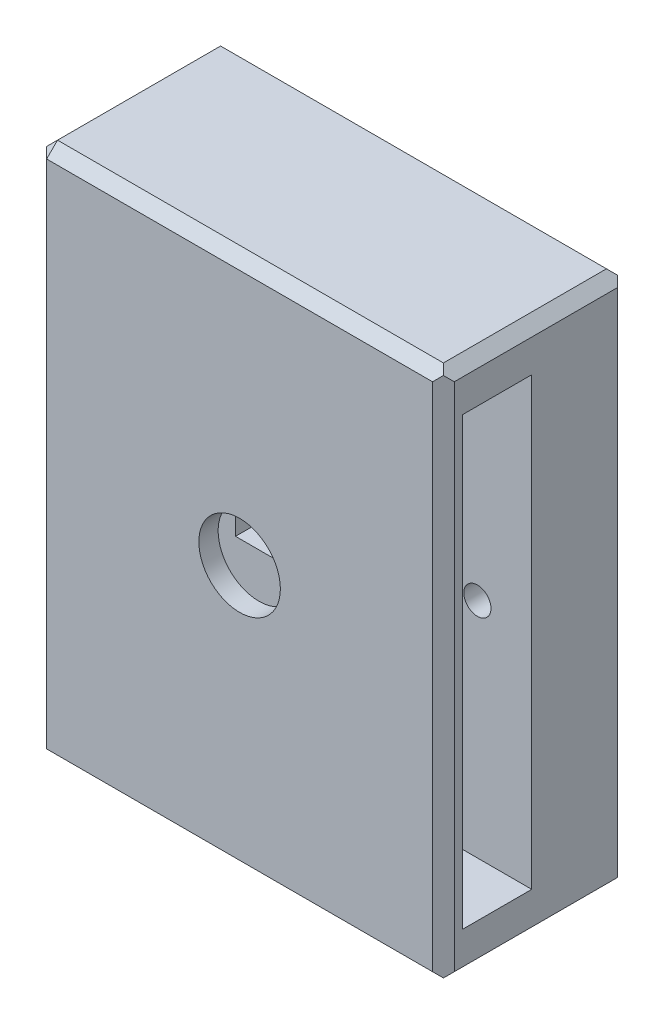
ISO-10303-21;
HEADER;
FILE_DESCRIPTION(('STEP AP214'),'2;1');
FILE_NAME('part.step','',(''),(''),'','','');
FILE_SCHEMA(('AUTOMOTIVE_DESIGN { 1 0 10303 214 1 1 1 1 }'));
ENDSEC;
DATA;
#1=APPLICATION_CONTEXT('core data for automotive mechanical design processes');
#2=APPLICATION_PROTOCOL_DEFINITION('international standard','automotive_design',2000,#1);
#3=PRODUCT_CONTEXT('',#1,'mechanical');
#4=PRODUCT('Part','Part','',(#3));
#5=PRODUCT_RELATED_PRODUCT_CATEGORY('part','',(#4));
#6=PRODUCT_DEFINITION_FORMATION('','',#4);
#7=PRODUCT_DEFINITION_CONTEXT('part definition',#1,'design');
#8=PRODUCT_DEFINITION('design','',#6,#7);
#9=PRODUCT_DEFINITION_SHAPE('','',#8);
#10=(LENGTH_UNIT() NAMED_UNIT(*) SI_UNIT(.MILLI.,.METRE.));
#11=(NAMED_UNIT(*) PLANE_ANGLE_UNIT() SI_UNIT($,.RADIAN.));
#12=(NAMED_UNIT(*) SI_UNIT($,.STERADIAN.) SOLID_ANGLE_UNIT());
#13=UNCERTAINTY_MEASURE_WITH_UNIT(LENGTH_MEASURE(1.E-05),#10,'distance_accuracy_value','');
#14=(GEOMETRIC_REPRESENTATION_CONTEXT(3) GLOBAL_UNCERTAINTY_ASSIGNED_CONTEXT((#13)) GLOBAL_UNIT_ASSIGNED_CONTEXT((#10,
#11,#12)) REPRESENTATION_CONTEXT('',''));
#15=CARTESIAN_POINT('',(0.,0.,0.));
#16=DIRECTION('',(0.,0.,1.));
#17=DIRECTION('',(1.,0.,0.));
#18=AXIS2_PLACEMENT_3D('',#15,#16,#17);
#19=CARTESIAN_POINT('',(0.,49.,0.));
#20=DIRECTION('',(1.,0.,0.));
#21=DIRECTION('',(0.,0.,-1.));
#22=AXIS2_PLACEMENT_3D('',#19,#20,#21);
#23=PLANE('',#22);
#24=DIRECTION('',(0.,-1.,0.));
#25=VECTOR('',#24,1.);
#26=CARTESIAN_POINT('',(0.,49.,-24.));
#27=LINE('',#26,#25);
#28=CARTESIAN_POINT('',(0.,48.,-24.));
#29=VERTEX_POINT('',#28);
#30=CARTESIAN_POINT('',(0.,0.999999999999994,-24.));
#31=VERTEX_POINT('',#30);
#32=EDGE_CURVE('E297',#29,#31,#27,.T.);
#33=ORIENTED_EDGE('',*,*,#32,.T.);
#34=DIRECTION('',(0.,0.,1.));
#35=VECTOR('',#34,1.);
#36=CARTESIAN_POINT('',(0.,0.999999999999994,-8.));
#37=LINE('',#36,#35);
#38=CARTESIAN_POINT('',(0.,0.999999999999994,-8.99999999999999));
#39=VERTEX_POINT('',#38);
#40=EDGE_CURVE('E306',#31,#39,#37,.T.);
#41=ORIENTED_EDGE('',*,*,#40,.T.);
#42=DIRECTION('',(0.,1.,0.));
#43=VECTOR('',#42,1.);
#44=CARTESIAN_POINT('',(0.,49.,-8.99999999999999));
#45=LINE('',#44,#43);
#46=CARTESIAN_POINT('',(0.,48.,-8.99999999999999));
#47=VERTEX_POINT('',#46);
#48=EDGE_CURVE('E303',#39,#47,#45,.T.);
#49=ORIENTED_EDGE('',*,*,#48,.T.);
#50=DIRECTION('',(0.,0.,-1.));
#51=VECTOR('',#50,1.);
#52=CARTESIAN_POINT('',(0.,48.,0.));
#53=LINE('',#52,#51);
#54=EDGE_CURVE('E300',#47,#29,#53,.T.);
#55=ORIENTED_EDGE('',*,*,#54,.T.);
#56=EDGE_LOOP('',(#33,#41,#49,#55));
#57=FACE_BOUND('',#56,.T.);
#58=DIRECTION('',(0.,1.,0.));
#59=VECTOR('',#58,1.);
#60=CARTESIAN_POINT('',(0.,49.,-16.125));
#61=LINE('',#60,#59);
#62=CARTESIAN_POINT('',(0.,4.,-16.125));
#63=VERTEX_POINT('',#62);
#64=CARTESIAN_POINT('',(0.,45.,-16.125));
#65=VERTEX_POINT('',#64);
#66=EDGE_CURVE('E246',#63,#65,#61,.T.);
#67=ORIENTED_EDGE('',*,*,#66,.T.);
#68=DIRECTION('',(0.,0.,1.));
#69=VECTOR('',#68,1.);
#70=CARTESIAN_POINT('',(0.,45.,0.));
#71=LINE('',#70,#69);
#72=CARTESIAN_POINT('',(0.,45.,-9.775));
#73=VERTEX_POINT('',#72);
#74=EDGE_CURVE('E250',#65,#73,#71,.T.);
#75=ORIENTED_EDGE('',*,*,#74,.T.);
#76=DIRECTION('',(0.,-1.,0.));
#77=VECTOR('',#76,1.);
#78=CARTESIAN_POINT('',(0.,49.,-9.77499999999999));
#79=LINE('',#78,#77);
#80=CARTESIAN_POINT('',(0.,4.,-9.77500000000001));
#81=VERTEX_POINT('',#80);
#82=EDGE_CURVE('E223',#73,#81,#79,.T.);
#83=ORIENTED_EDGE('',*,*,#82,.T.);
#84=DIRECTION('',(0.,0.,-1.));
#85=VECTOR('',#84,1.);
#86=CARTESIAN_POINT('',(0.,4.,0.));
#87=LINE('',#86,#85);
#88=EDGE_CURVE('E228',#81,#63,#87,.T.);
#89=ORIENTED_EDGE('',*,*,#88,.T.);
#90=EDGE_LOOP('',(#67,#75,#83,#89));
#91=FACE_BOUND('',#90,.T.);
#92=ADVANCED_FACE('F46',(#57,#91),#23,.F.);
#93=CARTESIAN_POINT('',(0.,49.,0.));
#94=DIRECTION('',(0.,-1.,0.));
#95=DIRECTION('',(0.,0.,-1.));
#96=AXIS2_PLACEMENT_3D('',#93,#94,#95);
#97=PLANE('',#96);
#98=DIRECTION('',(1.,0.,0.));
#99=VECTOR('',#98,1.);
#100=CARTESIAN_POINT('',(50.,49.,-8.99999999999999));
#101=LINE('',#100,#99);
#102=CARTESIAN_POINT('',(0.999999999999994,49.,-8.99999999999999));
#103=VERTEX_POINT('',#102);
#104=CARTESIAN_POINT('',(36.5,49.,-8.99999999999999));
#105=VERTEX_POINT('',#104);
#106=EDGE_CURVE('E283',#103,#105,#101,.T.);
#107=ORIENTED_EDGE('',*,*,#106,.T.);
#108=DIRECTION('',(0.,0.,-1.));
#109=VECTOR('',#108,1.);
#110=CARTESIAN_POINT('',(36.5,49.,0.));
#111=LINE('',#110,#109);
#112=CARTESIAN_POINT('',(36.5,49.,-24.));
#113=VERTEX_POINT('',#112);
#114=EDGE_CURVE('E407',#105,#113,#111,.T.);
#115=ORIENTED_EDGE('',*,*,#114,.T.);
#116=DIRECTION('',(-1.,0.,0.));
#117=VECTOR('',#116,1.);
#118=CARTESIAN_POINT('',(0.,49.,-24.));
#119=LINE('',#118,#117);
#120=CARTESIAN_POINT('',(0.999999999999994,49.,-24.));
#121=VERTEX_POINT('',#120);
#122=EDGE_CURVE('E274',#113,#121,#119,.T.);
#123=ORIENTED_EDGE('',*,*,#122,.T.);
#124=DIRECTION('',(0.,0.,1.));
#125=VECTOR('',#124,1.);
#126=CARTESIAN_POINT('',(0.999999999999994,49.,0.));
#127=LINE('',#126,#125);
#128=EDGE_CURVE('E280',#121,#103,#127,.T.);
#129=ORIENTED_EDGE('',*,*,#128,.T.);
#130=EDGE_LOOP('',(#107,#115,#123,#129));
#131=FACE_BOUND('',#130,.T.);
#132=ADVANCED_FACE('F451',(#131),#97,.F.);
#133=CARTESIAN_POINT('',(0.,0.,0.));
#134=DIRECTION('',(0.,-1.,0.));
#135=DIRECTION('',(0.,0.,-1.));
#136=AXIS2_PLACEMENT_3D('',#133,#134,#135);
#137=PLANE('',#136);
#138=DIRECTION('',(1.,0.,0.));
#139=VECTOR('',#138,1.);
#140=CARTESIAN_POINT('',(50.,0.,-24.));
#141=LINE('',#140,#139);
#142=CARTESIAN_POINT('',(0.999999999999994,0.,-24.));
#143=VERTEX_POINT('',#142);
#144=CARTESIAN_POINT('',(36.5,0.,-24.));
#145=VERTEX_POINT('',#144);
#146=EDGE_CURVE('E287',#143,#145,#141,.T.);
#147=ORIENTED_EDGE('',*,*,#146,.T.);
#148=DIRECTION('',(0.,0.,1.));
#149=VECTOR('',#148,1.);
#150=CARTESIAN_POINT('',(36.5,0.,-8.99999999999999));
#151=LINE('',#150,#149);
#152=CARTESIAN_POINT('',(36.5,0.,-8.99999999999999));
#153=VERTEX_POINT('',#152);
#154=EDGE_CURVE('E397',#145,#153,#151,.T.);
#155=ORIENTED_EDGE('',*,*,#154,.T.);
#156=DIRECTION('',(-1.,0.,0.));
#157=VECTOR('',#156,1.);
#158=CARTESIAN_POINT('',(0.,0.,-8.99999999999999));
#159=LINE('',#158,#157);
#160=CARTESIAN_POINT('',(0.999999999999994,0.,-8.99999999999999));
#161=VERTEX_POINT('',#160);
#162=EDGE_CURVE('E294',#153,#161,#159,.T.);
#163=ORIENTED_EDGE('',*,*,#162,.T.);
#164=DIRECTION('',(0.,0.,-1.));
#165=VECTOR('',#164,1.);
#166=CARTESIAN_POINT('',(0.999999999999994,0.,-25.));
#167=LINE('',#166,#165);
#168=EDGE_CURVE('E291',#161,#143,#167,.T.);
#169=ORIENTED_EDGE('',*,*,#168,.T.);
#170=EDGE_LOOP('',(#147,#155,#163,#169));
#171=FACE_BOUND('',#170,.T.);
#172=ADVANCED_FACE('F524',(#171),#137,.T.);
#173=CARTESIAN_POINT('',(0.,49.,-25.));
#174=DIRECTION('',(0.,0.,1.));
#175=DIRECTION('',(1.,0.,0.));
#176=AXIS2_PLACEMENT_3D('',#173,#174,#175);
#177=PLANE('',#176);
#178=DIRECTION('',(1.,0.,0.));
#179=VECTOR('',#178,1.);
#180=CARTESIAN_POINT('',(0.,48.,-25.));
#181=LINE('',#180,#179);
#182=CARTESIAN_POINT('',(0.999999999999994,48.,-25.));
#183=VERTEX_POINT('',#182);
#184=CARTESIAN_POINT('',(36.5,48.,-25.));
#185=VERTEX_POINT('',#184);
#186=EDGE_CURVE('E320',#183,#185,#181,.T.);
#187=ORIENTED_EDGE('',*,*,#186,.T.);
#188=DIRECTION('',(0.,-1.,0.));
#189=VECTOR('',#188,1.);
#190=CARTESIAN_POINT('',(36.5,49.,-25.));
#191=LINE('',#190,#189);
#192=CARTESIAN_POINT('',(36.5,0.999999999999994,-25.));
#193=VERTEX_POINT('',#192);
#194=EDGE_CURVE('E11',#185,#193,#191,.T.);
#195=ORIENTED_EDGE('',*,*,#194,.T.);
#196=DIRECTION('',(-1.,0.,0.));
#197=VECTOR('',#196,1.);
#198=CARTESIAN_POINT('',(0.,0.999999999999994,-25.));
#199=LINE('',#198,#197);
#200=CARTESIAN_POINT('',(0.999999999999994,0.999999999999994,-25.));
#201=VERTEX_POINT('',#200);
#202=EDGE_CURVE('E324',#193,#201,#199,.T.);
#203=ORIENTED_EDGE('',*,*,#202,.T.);
#204=DIRECTION('',(0.,1.,0.));
#205=VECTOR('',#204,1.);
#206=CARTESIAN_POINT('',(0.999999999999994,49.,-25.));
#207=LINE('',#206,#205);
#208=EDGE_CURVE('E327',#201,#183,#207,.T.);
#209=ORIENTED_EDGE('',*,*,#208,.T.);
#210=EDGE_LOOP('',(#187,#195,#203,#209));
#211=FACE_BOUND('',#210,.T.);
#212=CARTESIAN_POINT('',(32.5,24.5,-25.));
#213=DIRECTION('',(0.,0.,-1.));
#214=DIRECTION('',(-1.,0.,0.));
#215=AXIS2_PLACEMENT_3D('',#212,#213,#214);
#216=CIRCLE('',#215,1.25);
#217=CARTESIAN_POINT('',(31.25,24.5,-25.));
#218=VERTEX_POINT('',#217);
#219=EDGE_CURVE('E258',#218,#218,#216,.T.);
#220=ORIENTED_EDGE('',*,*,#219,.F.);
#221=EDGE_LOOP('',(#220));
#222=FACE_BOUND('',#221,.T.);
#223=DIRECTION('',(-1.,0.,0.));
#224=VECTOR('',#223,1.);
#225=CARTESIAN_POINT('',(29.75,18.5,-25.));
#226=LINE('',#225,#224);
#227=CARTESIAN_POINT('',(29.75,18.5,-25.));
#228=VERTEX_POINT('',#227);
#229=CARTESIAN_POINT('',(10.25,18.5,-25.));
#230=VERTEX_POINT('',#229);
#231=EDGE_CURVE('E895',#228,#230,#226,.T.);
#232=ORIENTED_EDGE('',*,*,#231,.F.);
#233=DIRECTION('',(0.,-1.,0.));
#234=VECTOR('',#233,1.);
#235=CARTESIAN_POINT('',(29.75,30.5,-25.));
#236=LINE('',#235,#234);
#237=CARTESIAN_POINT('',(29.75,30.5,-25.));
#238=VERTEX_POINT('',#237);
#239=EDGE_CURVE('E873',#238,#228,#236,.T.);
#240=ORIENTED_EDGE('',*,*,#239,.F.);
#241=DIRECTION('',(1.,0.,0.));
#242=VECTOR('',#241,1.);
#243=CARTESIAN_POINT('',(29.75,30.5,-25.));
#244=LINE('',#243,#242);
#245=CARTESIAN_POINT('',(10.25,30.5,-25.));
#246=VERTEX_POINT('',#245);
#247=EDGE_CURVE('E878',#246,#238,#244,.T.);
#248=ORIENTED_EDGE('',*,*,#247,.F.);
#249=DIRECTION('',(0.,1.,0.));
#250=VECTOR('',#249,1.);
#251=CARTESIAN_POINT('',(10.25,30.5,-25.));
#252=LINE('',#251,#250);
#253=EDGE_CURVE('E891',#230,#246,#252,.T.);
#254=ORIENTED_EDGE('',*,*,#253,.F.);
#255=EDGE_LOOP('',(#232,#240,#248,#254));
#256=FACE_BOUND('',#255,.T.);
#257=CARTESIAN_POINT('',(7.5,24.5,-25.));
#258=DIRECTION('',(0.,0.,-1.));
#259=DIRECTION('',(-1.,0.,0.));
#260=AXIS2_PLACEMENT_3D('',#257,#258,#259);
#261=CIRCLE('',#260,1.25);
#262=CARTESIAN_POINT('',(6.25,24.5,-25.));
#263=VERTEX_POINT('',#262);
#264=EDGE_CURVE('E233',#263,#263,#261,.T.);
#265=ORIENTED_EDGE('',*,*,#264,.F.);
#266=EDGE_LOOP('',(#265));
#267=FACE_BOUND('',#266,.T.);
#268=ADVANCED_FACE('F492',(#211,#222,#256,#267),#177,.F.);
#269=CARTESIAN_POINT('',(-5.,45.,-9.775));
#270=DIRECTION('',(0.,1.,0.));
#271=DIRECTION('',(0.,0.,1.));
#272=AXIS2_PLACEMENT_3D('',#269,#270,#271);
#273=PLANE('',#272);
#274=DIRECTION('',(1.,0.,0.));
#275=VECTOR('',#274,1.);
#276=CARTESIAN_POINT('',(-5.,45.,-16.125));
#277=LINE('',#276,#275);
#278=CARTESIAN_POINT('',(37.5,45.,-16.125));
#279=VERTEX_POINT('',#278);
#280=EDGE_CURVE('E216',#65,#279,#277,.T.);
#281=ORIENTED_EDGE('',*,*,#280,.T.);
#282=DIRECTION('',(0.,0.,1.));
#283=VECTOR('',#282,1.);
#284=CARTESIAN_POINT('',(37.5,45.,-9.775));
#285=LINE('',#284,#283);
#286=CARTESIAN_POINT('',(37.5,45.,-9.77499999999999));
#287=VERTEX_POINT('',#286);
#288=EDGE_CURVE('E200',#279,#287,#285,.T.);
#289=ORIENTED_EDGE('',*,*,#288,.T.);
#290=DIRECTION('',(1.,0.,0.));
#291=VECTOR('',#290,1.);
#292=CARTESIAN_POINT('',(-5.,45.,-9.775));
#293=LINE('',#292,#291);
#294=EDGE_CURVE('E213',#73,#287,#293,.T.);
#295=ORIENTED_EDGE('',*,*,#294,.F.);
#296=ORIENTED_EDGE('',*,*,#74,.F.);
#297=EDGE_LOOP('',(#281,#289,#295,#296));
#298=FACE_BOUND('',#297,.T.);
#299=ADVANCED_FACE('F212',(#298),#273,.F.);
#300=CARTESIAN_POINT('',(-5.,45.,-16.125));
#301=DIRECTION('',(0.,0.,-1.));
#302=DIRECTION('',(0.,1.,0.));
#303=AXIS2_PLACEMENT_3D('',#300,#301,#302);
#304=PLANE('',#303);
#305=CARTESIAN_POINT('',(32.5,24.5,-16.125));
#306=DIRECTION('',(0.,0.,-1.));
#307=DIRECTION('',(0.,1.,0.));
#308=AXIS2_PLACEMENT_3D('',#305,#306,#307);
#309=CIRCLE('',#308,1.25);
#310=CARTESIAN_POINT('',(32.5,25.75,-16.125));
#311=VERTEX_POINT('',#310);
#312=EDGE_CURVE('E241',#311,#311,#309,.T.);
#313=ORIENTED_EDGE('',*,*,#312,.T.);
#314=EDGE_LOOP('',(#313));
#315=FACE_BOUND('',#314,.T.);
#316=DIRECTION('',(1.,0.,0.));
#317=VECTOR('',#316,1.);
#318=CARTESIAN_POINT('',(-4.99999999999999,30.5,-16.125));
#319=LINE('',#318,#317);
#320=CARTESIAN_POINT('',(10.25,30.5,-16.125));
#321=VERTEX_POINT('',#320);
#322=CARTESIAN_POINT('',(29.75,30.5,-16.125));
#323=VERTEX_POINT('',#322);
#324=EDGE_CURVE('E266',#321,#323,#319,.T.);
#325=ORIENTED_EDGE('',*,*,#324,.T.);
#326=DIRECTION('',(0.,-1.,0.));
#327=VECTOR('',#326,1.);
#328=CARTESIAN_POINT('',(29.75,45.,-16.125));
#329=LINE('',#328,#327);
#330=CARTESIAN_POINT('',(29.75,18.5,-16.125));
#331=VERTEX_POINT('',#330);
#332=EDGE_CURVE('E270',#323,#331,#329,.T.);
#333=ORIENTED_EDGE('',*,*,#332,.T.);
#334=DIRECTION('',(-1.,0.,0.));
#335=VECTOR('',#334,1.);
#336=CARTESIAN_POINT('',(-5.,18.5,-16.125));
#337=LINE('',#336,#335);
#338=CARTESIAN_POINT('',(10.25,18.5,-16.125));
#339=VERTEX_POINT('',#338);
#340=EDGE_CURVE('E253',#331,#339,#337,.T.);
#341=ORIENTED_EDGE('',*,*,#340,.T.);
#342=DIRECTION('',(0.,1.,0.));
#343=VECTOR('',#342,1.);
#344=CARTESIAN_POINT('',(10.25,45.,-16.125));
#345=LINE('',#344,#343);
#346=EDGE_CURVE('E262',#339,#321,#345,.T.);
#347=ORIENTED_EDGE('',*,*,#346,.T.);
#348=EDGE_LOOP('',(#325,#333,#341,#347));
#349=FACE_BOUND('',#348,.T.);
#350=CARTESIAN_POINT('',(7.5,24.5,-16.125));
#351=DIRECTION('',(0.,0.,-1.));
#352=DIRECTION('',(0.,1.,0.));
#353=AXIS2_PLACEMENT_3D('',#350,#351,#352);
#354=CIRCLE('',#353,1.25);
#355=CARTESIAN_POINT('',(7.5,25.75,-16.125));
#356=VERTEX_POINT('',#355);
#357=EDGE_CURVE('E254',#356,#356,#354,.T.);
#358=ORIENTED_EDGE('',*,*,#357,.T.);
#359=EDGE_LOOP('',(#358));
#360=FACE_BOUND('',#359,.T.);
#361=DIRECTION('',(1.,0.,0.));
#362=VECTOR('',#361,1.);
#363=CARTESIAN_POINT('',(-5.,4.,-16.125));
#364=LINE('',#363,#362);
#365=CARTESIAN_POINT('',(37.5,4.,-16.125));
#366=VERTEX_POINT('',#365);
#367=EDGE_CURVE('E230',#63,#366,#364,.T.);
#368=ORIENTED_EDGE('',*,*,#367,.T.);
#369=DIRECTION('',(0.,1.,0.));
#370=VECTOR('',#369,1.);
#371=CARTESIAN_POINT('',(37.5,45.,-16.125));
#372=LINE('',#371,#370);
#373=EDGE_CURVE('E219',#366,#279,#372,.T.);
#374=ORIENTED_EDGE('',*,*,#373,.T.);
#375=ORIENTED_EDGE('',*,*,#280,.F.);
#376=ORIENTED_EDGE('',*,*,#66,.F.);
#377=EDGE_LOOP('',(#368,#374,#375,#376));
#378=FACE_BOUND('',#377,.T.);
#379=ADVANCED_FACE('F636',(#315,#349,#360,#378),#304,.F.);
#380=CARTESIAN_POINT('',(-5.,4.,-9.77500000000001));
#381=DIRECTION('',(0.,-1.,0.));
#382=DIRECTION('',(0.,0.,-1.));
#383=AXIS2_PLACEMENT_3D('',#380,#381,#382);
#384=PLANE('',#383);
#385=DIRECTION('',(1.,0.,0.));
#386=VECTOR('',#385,1.);
#387=CARTESIAN_POINT('',(-5.,4.,-9.77500000000001));
#388=LINE('',#387,#386);
#389=CARTESIAN_POINT('',(37.5,4.,-9.77500000000001));
#390=VERTEX_POINT('',#389);
#391=EDGE_CURVE('E239',#81,#390,#388,.T.);
#392=ORIENTED_EDGE('',*,*,#391,.T.);
#393=DIRECTION('',(0.,0.,-1.));
#394=VECTOR('',#393,1.);
#395=CARTESIAN_POINT('',(37.5,4.,-9.77500000000001));
#396=LINE('',#395,#394);
#397=EDGE_CURVE('E203',#390,#366,#396,.T.);
#398=ORIENTED_EDGE('',*,*,#397,.T.);
#399=ORIENTED_EDGE('',*,*,#367,.F.);
#400=ORIENTED_EDGE('',*,*,#88,.F.);
#401=EDGE_LOOP('',(#392,#398,#399,#400));
#402=FACE_BOUND('',#401,.T.);
#403=ADVANCED_FACE('F639',(#402),#384,.F.);
#404=CARTESIAN_POINT('',(-5.,13.75,-9.775));
#405=DIRECTION('',(0.,0.,1.));
#406=DIRECTION('',(0.,-1.,0.));
#407=AXIS2_PLACEMENT_3D('',#404,#405,#406);
#408=PLANE('',#407);
#409=CARTESIAN_POINT('',(18.75,24.5,-9.775));
#410=DIRECTION('',(0.,0.,1.));
#411=DIRECTION('',(0.,-1.,0.));
#412=AXIS2_PLACEMENT_3D('',#409,#410,#411);
#413=CIRCLE('',#412,3.75);
#414=CARTESIAN_POINT('',(18.75,20.75,-9.775));
#415=VERTEX_POINT('',#414);
#416=EDGE_CURVE('E427',#415,#415,#413,.T.);
#417=ORIENTED_EDGE('',*,*,#416,.T.);
#418=EDGE_LOOP('',(#417));
#419=FACE_BOUND('',#418,.T.);
#420=ORIENTED_EDGE('',*,*,#294,.T.);
#421=DIRECTION('',(0.,-1.,0.));
#422=VECTOR('',#421,1.);
#423=CARTESIAN_POINT('',(37.5,13.75,-9.775));
#424=LINE('',#423,#422);
#425=EDGE_CURVE('E197',#287,#390,#424,.T.);
#426=ORIENTED_EDGE('',*,*,#425,.T.);
#427=ORIENTED_EDGE('',*,*,#391,.F.);
#428=ORIENTED_EDGE('',*,*,#82,.F.);
#429=EDGE_LOOP('',(#420,#426,#427,#428));
#430=FACE_BOUND('',#429,.T.);
#431=ADVANCED_FACE('F221',(#419,#430),#408,.F.);
#432=CARTESIAN_POINT('',(7.5,24.5,-12.5));
#433=DIRECTION('',(0.,0.,-1.));
#434=DIRECTION('',(-1.,0.,0.));
#435=AXIS2_PLACEMENT_3D('',#432,#433,#434);
#436=CYLINDRICAL_SURFACE('',#435,1.25);
#437=ORIENTED_EDGE('',*,*,#264,.T.);
#438=EDGE_LOOP('',(#437));
#439=FACE_BOUND('',#438,.T.);
#440=ORIENTED_EDGE('',*,*,#357,.F.);
#441=EDGE_LOOP('',(#440));
#442=FACE_BOUND('',#441,.T.);
#443=ADVANCED_FACE('F619',(#439,#442),#436,.F.);
#444=CARTESIAN_POINT('',(29.75,30.5,-12.5));
#445=DIRECTION('',(1.,0.,0.));
#446=DIRECTION('',(0.,0.,-1.));
#447=AXIS2_PLACEMENT_3D('',#444,#445,#446);
#448=PLANE('',#447);
#449=DIRECTION('',(0.,0.,-1.));
#450=VECTOR('',#449,1.);
#451=CARTESIAN_POINT('',(29.75,30.5,-12.5));
#452=LINE('',#451,#450);
#453=EDGE_CURVE('E885',#323,#238,#452,.T.);
#454=ORIENTED_EDGE('',*,*,#453,.T.);
#455=ORIENTED_EDGE('',*,*,#239,.T.);
#456=DIRECTION('',(0.,0.,-1.));
#457=VECTOR('',#456,1.);
#458=CARTESIAN_POINT('',(29.75,18.5,-12.5));
#459=LINE('',#458,#457);
#460=EDGE_CURVE('E874',#331,#228,#459,.T.);
#461=ORIENTED_EDGE('',*,*,#460,.F.);
#462=ORIENTED_EDGE('',*,*,#332,.F.);
#463=EDGE_LOOP('',(#454,#455,#461,#462));
#464=FACE_BOUND('',#463,.T.);
#465=ADVANCED_FACE('F615',(#464),#448,.F.);
#466=CARTESIAN_POINT('',(29.75,30.5,-12.5));
#467=DIRECTION('',(0.,1.,0.));
#468=DIRECTION('',(-1.,0.,0.));
#469=AXIS2_PLACEMENT_3D('',#466,#467,#468);
#470=PLANE('',#469);
#471=DIRECTION('',(0.,0.,-1.));
#472=VECTOR('',#471,1.);
#473=CARTESIAN_POINT('',(10.25,30.5,-12.5));
#474=LINE('',#473,#472);
#475=EDGE_CURVE('E882',#321,#246,#474,.T.);
#476=ORIENTED_EDGE('',*,*,#475,.T.);
#477=ORIENTED_EDGE('',*,*,#247,.T.);
#478=ORIENTED_EDGE('',*,*,#453,.F.);
#479=ORIENTED_EDGE('',*,*,#324,.F.);
#480=EDGE_LOOP('',(#476,#477,#478,#479));
#481=FACE_BOUND('',#480,.T.);
#482=ADVANCED_FACE('F618',(#481),#470,.F.);
#483=CARTESIAN_POINT('',(10.25,30.5,-12.5));
#484=DIRECTION('',(-1.,0.,0.));
#485=DIRECTION('',(0.,0.,1.));
#486=AXIS2_PLACEMENT_3D('',#483,#484,#485);
#487=PLANE('',#486);
#488=DIRECTION('',(0.,0.,-1.));
#489=VECTOR('',#488,1.);
#490=CARTESIAN_POINT('',(10.25,18.5,-12.5));
#491=LINE('',#490,#489);
#492=EDGE_CURVE('E879',#339,#230,#491,.T.);
#493=ORIENTED_EDGE('',*,*,#492,.T.);
#494=ORIENTED_EDGE('',*,*,#253,.T.);
#495=ORIENTED_EDGE('',*,*,#475,.F.);
#496=ORIENTED_EDGE('',*,*,#346,.F.);
#497=EDGE_LOOP('',(#493,#494,#495,#496));
#498=FACE_BOUND('',#497,.T.);
#499=ADVANCED_FACE('F623',(#498),#487,.F.);
#500=CARTESIAN_POINT('',(29.75,18.5,-12.5));
#501=DIRECTION('',(0.,-1.,0.));
#502=DIRECTION('',(0.,0.,-1.));
#503=AXIS2_PLACEMENT_3D('',#500,#501,#502);
#504=PLANE('',#503);
#505=ORIENTED_EDGE('',*,*,#460,.T.);
#506=ORIENTED_EDGE('',*,*,#231,.T.);
#507=ORIENTED_EDGE('',*,*,#492,.F.);
#508=ORIENTED_EDGE('',*,*,#340,.F.);
#509=EDGE_LOOP('',(#505,#506,#507,#508));
#510=FACE_BOUND('',#509,.T.);
#511=ADVANCED_FACE('F613',(#510),#504,.F.);
#512=CARTESIAN_POINT('',(32.5,24.5,-12.5));
#513=DIRECTION('',(0.,0.,-1.));
#514=DIRECTION('',(-1.,0.,0.));
#515=AXIS2_PLACEMENT_3D('',#512,#513,#514);
#516=CYLINDRICAL_SURFACE('',#515,1.25);
#517=ORIENTED_EDGE('',*,*,#219,.T.);
#518=EDGE_LOOP('',(#517));
#519=FACE_BOUND('',#518,.T.);
#520=ORIENTED_EDGE('',*,*,#312,.F.);
#521=EDGE_LOOP('',(#520));
#522=FACE_BOUND('',#521,.T.);
#523=ADVANCED_FACE('F610',(#519,#522),#516,.F.);
#524=CARTESIAN_POINT('',(0.,0.,-8.));
#525=DIRECTION('',(0.,0.,1.));
#526=DIRECTION('',(1.,0.,0.));
#527=AXIS2_PLACEMENT_3D('',#524,#525,#526);
#528=PLANE('',#527);
#529=CARTESIAN_POINT('',(18.75,24.5,-8.));
#530=DIRECTION('',(0.,0.,1.));
#531=DIRECTION('',(1.,0.,0.));
#532=AXIS2_PLACEMENT_3D('',#529,#530,#531);
#533=CIRCLE('',#532,3.75);
#534=CARTESIAN_POINT('',(22.5,24.5,-8.));
#535=VERTEX_POINT('',#534);
#536=EDGE_CURVE('E858',#535,#535,#533,.T.);
#537=ORIENTED_EDGE('',*,*,#536,.F.);
#538=EDGE_LOOP('',(#537));
#539=FACE_BOUND('',#538,.T.);
#540=DIRECTION('',(1.,0.,0.));
#541=VECTOR('',#540,1.);
#542=CARTESIAN_POINT('',(0.,0.999999999999994,-8.));
#543=LINE('',#542,#541);
#544=CARTESIAN_POINT('',(0.999999999999994,0.999999999999994,-8.));
#545=VERTEX_POINT('',#544);
#546=CARTESIAN_POINT('',(36.5,0.999999999999994,-8.));
#547=VERTEX_POINT('',#546);
#548=EDGE_CURVE('E313',#545,#547,#543,.T.);
#549=ORIENTED_EDGE('',*,*,#548,.T.);
#550=DIRECTION('',(0.,1.,0.));
#551=VECTOR('',#550,1.);
#552=CARTESIAN_POINT('',(36.5,48.,-8.));
#553=LINE('',#552,#551);
#554=CARTESIAN_POINT('',(36.5,48.,-8.));
#555=VERTEX_POINT('',#554);
#556=EDGE_CURVE('E57',#547,#555,#553,.T.);
#557=ORIENTED_EDGE('',*,*,#556,.T.);
#558=DIRECTION('',(-1.,0.,0.));
#559=VECTOR('',#558,1.);
#560=CARTESIAN_POINT('',(0.,48.,-8.));
#561=LINE('',#560,#559);
#562=CARTESIAN_POINT('',(0.999999999999994,48.,-8.));
#563=VERTEX_POINT('',#562);
#564=EDGE_CURVE('E310',#555,#563,#561,.T.);
#565=ORIENTED_EDGE('',*,*,#564,.T.);
#566=DIRECTION('',(0.,-1.,0.));
#567=VECTOR('',#566,1.);
#568=CARTESIAN_POINT('',(0.999999999999994,0.,-8.));
#569=LINE('',#568,#567);
#570=EDGE_CURVE('E316',#563,#545,#569,.T.);
#571=ORIENTED_EDGE('',*,*,#570,.T.);
#572=EDGE_LOOP('',(#549,#557,#565,#571));
#573=FACE_BOUND('',#572,.T.);
#574=ADVANCED_FACE('F464',(#539,#573),#528,.T.);
#575=CARTESIAN_POINT('',(0.,0.999999999999994,0.));
#576=DIRECTION('',(-0.707106781186547,-0.707106781186547,0.));
#577=DIRECTION('',(0.,0.,-1.));
#578=AXIS2_PLACEMENT_3D('',#575,#576,#577);
#579=PLANE('',#578);
#580=DIRECTION('',(0.707106781186547,-0.707106781186547,0.));
#581=VECTOR('',#580,1.);
#582=CARTESIAN_POINT('',(0.,0.999999999999994,-8.99999999999999));
#583=LINE('',#582,#581);
#584=EDGE_CURVE('E375',#39,#161,#583,.T.);
#585=ORIENTED_EDGE('',*,*,#584,.F.);
#586=ORIENTED_EDGE('',*,*,#40,.F.);
#587=DIRECTION('',(-0.707106781186547,0.707106781186547,0.));
#588=VECTOR('',#587,1.);
#589=CARTESIAN_POINT('',(0.999999999999994,0.,-24.));
#590=LINE('',#589,#588);
#591=EDGE_CURVE('E371',#143,#31,#590,.T.);
#592=ORIENTED_EDGE('',*,*,#591,.F.);
#593=ORIENTED_EDGE('',*,*,#168,.F.);
#594=EDGE_LOOP('',(#585,#586,#592,#593));
#595=FACE_BOUND('',#594,.T.);
#596=ADVANCED_FACE('F475',(#595),#579,.T.);
#597=CARTESIAN_POINT('',(0.,0.999999999999994,-8.99999999999999));
#598=DIRECTION('',(-0.577350269189626,-0.577350269189626,0.577350269189626));
#599=DIRECTION('',(0.707106781186547,0.,0.707106781186547));
#600=AXIS2_PLACEMENT_3D('',#597,#598,#599);
#601=PLANE('',#600);
#602=DIRECTION('',(-0.707106781186547,0.,-0.707106781186547));
#603=VECTOR('',#602,1.);
#604=CARTESIAN_POINT('',(0.,0.999999999999994,-8.99999999999999));
#605=LINE('',#604,#603);
#606=EDGE_CURVE('E363',#39,#545,#605,.F.);
#607=ORIENTED_EDGE('',*,*,#606,.F.);
#608=ORIENTED_EDGE('',*,*,#584,.T.);
#609=DIRECTION('',(0.,-0.707106781186547,-0.707106781186547));
#610=VECTOR('',#609,1.);
#611=CARTESIAN_POINT('',(0.999999999999994,0.499999999999997,-8.5));
#612=LINE('',#611,#610);
#613=EDGE_CURVE('E367',#545,#161,#612,.T.);
#614=ORIENTED_EDGE('',*,*,#613,.F.);
#615=EDGE_LOOP('',(#607,#608,#614));
#616=FACE_BOUND('',#615,.T.);
#617=ADVANCED_FACE('F471',(#616),#601,.T.);
#618=CARTESIAN_POINT('',(0.999999999999994,0.,-24.));
#619=DIRECTION('',(-0.577350269189626,-0.577350269189626,-0.577350269189626));
#620=DIRECTION('',(-0.707106781186547,0.,0.707106781186547));
#621=AXIS2_PLACEMENT_3D('',#618,#619,#620);
#622=PLANE('',#621);
#623=DIRECTION('',(0.,-0.707106781186547,0.707106781186547));
#624=VECTOR('',#623,1.);
#625=CARTESIAN_POINT('',(0.999999999999994,0.,-24.));
#626=LINE('',#625,#624);
#627=EDGE_CURVE('E355',#143,#201,#626,.F.);
#628=ORIENTED_EDGE('',*,*,#627,.F.);
#629=ORIENTED_EDGE('',*,*,#591,.T.);
#630=DIRECTION('',(-0.707106781186547,0.,0.707106781186547));
#631=VECTOR('',#630,1.);
#632=CARTESIAN_POINT('',(0.499999999999997,0.999999999999994,-24.5));
#633=LINE('',#632,#631);
#634=EDGE_CURVE('E359',#201,#31,#633,.T.);
#635=ORIENTED_EDGE('',*,*,#634,.F.);
#636=EDGE_LOOP('',(#628,#629,#635));
#637=FACE_BOUND('',#636,.T.);
#638=ADVANCED_FACE('F504',(#637),#622,.T.);
#639=CARTESIAN_POINT('',(0.,0.999999999999994,-8.));
#640=DIRECTION('',(0.,0.707106781186547,-0.707106781186547));
#641=DIRECTION('',(1.,0.,0.));
#642=AXIS2_PLACEMENT_3D('',#639,#640,#641);
#643=PLANE('',#642);
#644=ORIENTED_EDGE('',*,*,#162,.F.);
#645=DIRECTION('',(-0.577350269189628,-0.577350269189625,-0.577350269189625));
#646=VECTOR('',#645,1.);
#647=CARTESIAN_POINT('',(24.9999999999999,-11.5,-20.5));
#648=LINE('',#647,#646);
#649=CARTESIAN_POINT('',(37.,0.499999999999995,-8.5));
#650=VERTEX_POINT('',#649);
#651=EDGE_CURVE('E404',#153,#650,#648,.F.);
#652=ORIENTED_EDGE('',*,*,#651,.T.);
#653=DIRECTION('',(0.577350269189628,-0.577350269189625,-0.577350269189625));
#654=VECTOR('',#653,1.);
#655=CARTESIAN_POINT('',(24.3333333333332,13.1666666666667,4.16666666666669));
#656=LINE('',#655,#654);
#657=EDGE_CURVE('E401',#650,#547,#656,.F.);
#658=ORIENTED_EDGE('',*,*,#657,.T.);
#659=ORIENTED_EDGE('',*,*,#548,.F.);
#660=ORIENTED_EDGE('',*,*,#613,.T.);
#661=EDGE_LOOP('',(#644,#652,#658,#659,#660));
#662=FACE_BOUND('',#661,.T.);
#663=ADVANCED_FACE('F506',(#662),#643,.F.);
#664=CARTESIAN_POINT('',(0.999999999999994,0.,-8.));
#665=DIRECTION('',(-0.707106781186547,0.,0.707106781186547));
#666=DIRECTION('',(0.,1.,0.));
#667=AXIS2_PLACEMENT_3D('',#664,#665,#666);
#668=PLANE('',#667);
#669=ORIENTED_EDGE('',*,*,#606,.T.);
#670=ORIENTED_EDGE('',*,*,#570,.F.);
#671=DIRECTION('',(0.707106781186547,0.,0.707106781186547));
#672=VECTOR('',#671,1.);
#673=CARTESIAN_POINT('',(0.,48.,-8.99999999999999));
#674=LINE('',#673,#672);
#675=EDGE_CURVE('E351',#47,#563,#674,.T.);
#676=ORIENTED_EDGE('',*,*,#675,.F.);
#677=ORIENTED_EDGE('',*,*,#48,.F.);
#678=EDGE_LOOP('',(#669,#670,#676,#677));
#679=FACE_BOUND('',#678,.T.);
#680=ADVANCED_FACE('F466',(#679),#668,.T.);
#681=CARTESIAN_POINT('',(0.999999999999994,49.,0.));
#682=DIRECTION('',(0.707106781186547,-0.707106781186547,0.));
#683=DIRECTION('',(0.,0.,1.));
#684=AXIS2_PLACEMENT_3D('',#681,#682,#683);
#685=PLANE('',#684);
#686=DIRECTION('',(-0.707106781186547,-0.707106781186547,0.));
#687=VECTOR('',#686,1.);
#688=CARTESIAN_POINT('',(0.,48.,-24.));
#689=LINE('',#688,#687);
#690=EDGE_CURVE('E343',#29,#121,#689,.F.);
#691=ORIENTED_EDGE('',*,*,#690,.F.);
#692=ORIENTED_EDGE('',*,*,#54,.F.);
#693=DIRECTION('',(0.707106781186547,0.707106781186547,0.));
#694=VECTOR('',#693,1.);
#695=CARTESIAN_POINT('',(0.,48.,-8.99999999999999));
#696=LINE('',#695,#694);
#697=EDGE_CURVE('E347',#103,#47,#696,.F.);
#698=ORIENTED_EDGE('',*,*,#697,.F.);
#699=ORIENTED_EDGE('',*,*,#128,.F.);
#700=EDGE_LOOP('',(#691,#692,#698,#699));
#701=FACE_BOUND('',#700,.T.);
#702=ADVANCED_FACE('F459',(#701),#685,.F.);
#703=CARTESIAN_POINT('',(0.,49.,-24.));
#704=DIRECTION('',(0.707106781186547,0.,0.707106781186547));
#705=DIRECTION('',(0.,-1.,0.));
#706=AXIS2_PLACEMENT_3D('',#703,#704,#705);
#707=PLANE('',#706);
#708=ORIENTED_EDGE('',*,*,#634,.T.);
#709=ORIENTED_EDGE('',*,*,#32,.F.);
#710=DIRECTION('',(0.707106781186547,0.,-0.707106781186547));
#711=VECTOR('',#710,1.);
#712=CARTESIAN_POINT('',(0.,48.,-24.));
#713=LINE('',#712,#711);
#714=EDGE_CURVE('E339',#183,#29,#713,.F.);
#715=ORIENTED_EDGE('',*,*,#714,.F.);
#716=ORIENTED_EDGE('',*,*,#208,.F.);
#717=EDGE_LOOP('',(#708,#709,#715,#716));
#718=FACE_BOUND('',#717,.T.);
#719=ADVANCED_FACE('F482',(#718),#707,.F.);
#720=CARTESIAN_POINT('',(0.,0.999999999999994,-25.));
#721=DIRECTION('',(0.,-0.707106781186547,-0.707106781186547));
#722=DIRECTION('',(1.,0.,0.));
#723=AXIS2_PLACEMENT_3D('',#720,#721,#722);
#724=PLANE('',#723);
#725=DIRECTION('',(-0.577350269189623,0.577350269189627,-0.577350269189627));
#726=VECTOR('',#725,1.);
#727=CARTESIAN_POINT('',(24.3333333333334,13.1666666666666,-37.1666666666666));
#728=LINE('',#727,#726);
#729=CARTESIAN_POINT('',(37.,0.499999999999992,-24.5));
#730=VERTEX_POINT('',#729);
#731=EDGE_CURVE('E391',#193,#730,#728,.F.);
#732=ORIENTED_EDGE('',*,*,#731,.T.);
#733=DIRECTION('',(-0.577350269189628,-0.577350269189625,0.577350269189625));
#734=VECTOR('',#733,1.);
#735=CARTESIAN_POINT('',(24.9999999999999,-11.5,-12.5));
#736=LINE('',#735,#734);
#737=EDGE_CURVE('E394',#730,#145,#736,.T.);
#738=ORIENTED_EDGE('',*,*,#737,.T.);
#739=ORIENTED_EDGE('',*,*,#146,.F.);
#740=ORIENTED_EDGE('',*,*,#627,.T.);
#741=ORIENTED_EDGE('',*,*,#202,.F.);
#742=EDGE_LOOP('',(#732,#738,#739,#740,#741));
#743=FACE_BOUND('',#742,.T.);
#744=ADVANCED_FACE('F500',(#743),#724,.T.);
#745=CARTESIAN_POINT('',(0.,48.,-8.99999999999999));
#746=DIRECTION('',(-0.577350269189626,0.577350269189626,0.577350269189626));
#747=DIRECTION('',(0.707106781186547,0.,0.707106781186547));
#748=AXIS2_PLACEMENT_3D('',#745,#746,#747);
#749=PLANE('',#748);
#750=ORIENTED_EDGE('',*,*,#697,.T.);
#751=ORIENTED_EDGE('',*,*,#675,.T.);
#752=DIRECTION('',(0.,0.707106781186547,-0.707106781186547));
#753=VECTOR('',#752,1.);
#754=CARTESIAN_POINT('',(0.999999999999994,48.5,-8.5));
#755=LINE('',#754,#753);
#756=EDGE_CURVE('E335',#103,#563,#755,.F.);
#757=ORIENTED_EDGE('',*,*,#756,.F.);
#758=EDGE_LOOP('',(#750,#751,#757));
#759=FACE_BOUND('',#758,.T.);
#760=ADVANCED_FACE('F462',(#759),#749,.T.);
#761=CARTESIAN_POINT('',(0.,48.,-24.));
#762=DIRECTION('',(-0.577350269189626,0.577350269189626,-0.577350269189626));
#763=DIRECTION('',(-0.707106781186547,0.,0.707106781186547));
#764=AXIS2_PLACEMENT_3D('',#761,#762,#763);
#765=PLANE('',#764);
#766=ORIENTED_EDGE('',*,*,#714,.T.);
#767=ORIENTED_EDGE('',*,*,#690,.T.);
#768=DIRECTION('',(0.,0.707106781186547,0.707106781186547));
#769=VECTOR('',#768,1.);
#770=CARTESIAN_POINT('',(0.999999999999994,48.5,-24.5));
#771=LINE('',#770,#769);
#772=EDGE_CURVE('E218',#183,#121,#771,.T.);
#773=ORIENTED_EDGE('',*,*,#772,.F.);
#774=EDGE_LOOP('',(#766,#767,#773));
#775=FACE_BOUND('',#774,.T.);
#776=ADVANCED_FACE('F487',(#775),#765,.T.);
#777=CARTESIAN_POINT('',(0.,48.,-8.));
#778=DIRECTION('',(0.,0.707106781186547,0.707106781186547));
#779=DIRECTION('',(1.,0.,0.));
#780=AXIS2_PLACEMENT_3D('',#777,#778,#779);
#781=PLANE('',#780);
#782=DIRECTION('',(0.577350269189628,0.577350269189625,-0.577350269189625));
#783=VECTOR('',#782,1.);
#784=CARTESIAN_POINT('',(24.3333333333332,35.8333333333333,4.16666666666669));
#785=LINE('',#784,#783);
#786=CARTESIAN_POINT('',(37.,48.5,-8.50000000000001));
#787=VERTEX_POINT('',#786);
#788=EDGE_CURVE('E65',#555,#787,#785,.T.);
#789=ORIENTED_EDGE('',*,*,#788,.T.);
#790=DIRECTION('',(0.577350269189623,-0.577350269189627,0.577350269189627));
#791=VECTOR('',#790,1.);
#792=CARTESIAN_POINT('',(25.0000000000001,60.5,-20.5));
#793=LINE('',#792,#791);
#794=EDGE_CURVE('E418',#787,#105,#793,.F.);
#795=ORIENTED_EDGE('',*,*,#794,.T.);
#796=ORIENTED_EDGE('',*,*,#106,.F.);
#797=ORIENTED_EDGE('',*,*,#756,.T.);
#798=ORIENTED_EDGE('',*,*,#564,.F.);
#799=EDGE_LOOP('',(#789,#795,#796,#797,#798));
#800=FACE_BOUND('',#799,.T.);
#801=ADVANCED_FACE('F449',(#800),#781,.T.);
#802=CARTESIAN_POINT('',(0.,49.,-24.));
#803=DIRECTION('',(0.,-0.707106781186547,0.707106781186547));
#804=DIRECTION('',(-1.,0.,0.));
#805=AXIS2_PLACEMENT_3D('',#802,#803,#804);
#806=PLANE('',#805);
#807=ORIENTED_EDGE('',*,*,#122,.F.);
#808=DIRECTION('',(0.577350269189623,-0.577350269189627,-0.577350269189627));
#809=VECTOR('',#808,1.);
#810=CARTESIAN_POINT('',(24.3333333333334,61.1666666666667,-11.8333333333334));
#811=LINE('',#810,#809);
#812=CARTESIAN_POINT('',(37.,48.5,-24.5));
#813=VERTEX_POINT('',#812);
#814=EDGE_CURVE('E413',#113,#813,#811,.T.);
#815=ORIENTED_EDGE('',*,*,#814,.T.);
#816=DIRECTION('',(-0.577350269189623,-0.577350269189627,-0.577350269189627));
#817=VECTOR('',#816,1.);
#818=CARTESIAN_POINT('',(25.0000000000001,36.5,-36.5));
#819=LINE('',#818,#817);
#820=EDGE_CURVE('E410',#813,#185,#819,.T.);
#821=ORIENTED_EDGE('',*,*,#820,.T.);
#822=ORIENTED_EDGE('',*,*,#186,.F.);
#823=ORIENTED_EDGE('',*,*,#772,.T.);
#824=EDGE_LOOP('',(#807,#815,#821,#822,#823));
#825=FACE_BOUND('',#824,.T.);
#826=ADVANCED_FACE('F489',(#825),#806,.F.);
#827=CARTESIAN_POINT('',(37.5,0.,0.));
#828=DIRECTION('',(-1.,0.,0.));
#829=DIRECTION('',(0.,0.,1.));
#830=AXIS2_PLACEMENT_3D('',#827,#828,#829);
#831=PLANE('',#830);
#832=DIRECTION('',(0.,0.,1.));
#833=VECTOR('',#832,1.);
#834=CARTESIAN_POINT('',(37.5,48.,0.));
#835=LINE('',#834,#833);
#836=CARTESIAN_POINT('',(37.5,48.,-24.));
#837=VERTEX_POINT('',#836);
#838=CARTESIAN_POINT('',(37.5,48.,-9.));
#839=VERTEX_POINT('',#838);
#840=EDGE_CURVE('E381',#837,#839,#835,.T.);
#841=ORIENTED_EDGE('',*,*,#840,.T.);
#842=DIRECTION('',(0.,-1.,0.));
#843=VECTOR('',#842,1.);
#844=CARTESIAN_POINT('',(37.5,0.999999999999994,-9.));
#845=LINE('',#844,#843);
#846=CARTESIAN_POINT('',(37.5,1.,-9.));
#847=VERTEX_POINT('',#846);
#848=EDGE_CURVE('E388',#839,#847,#845,.T.);
#849=ORIENTED_EDGE('',*,*,#848,.T.);
#850=DIRECTION('',(0.,0.,-1.));
#851=VECTOR('',#850,1.);
#852=CARTESIAN_POINT('',(37.5,1.,-24.));
#853=LINE('',#852,#851);
#854=CARTESIAN_POINT('',(37.5,1.,-24.));
#855=VERTEX_POINT('',#854);
#856=EDGE_CURVE('E384',#847,#855,#853,.T.);
#857=ORIENTED_EDGE('',*,*,#856,.T.);
#858=DIRECTION('',(0.,1.,0.));
#859=VECTOR('',#858,1.);
#860=CARTESIAN_POINT('',(37.5,0.,-24.));
#861=LINE('',#860,#859);
#862=EDGE_CURVE('E331',#855,#837,#861,.T.);
#863=ORIENTED_EDGE('',*,*,#862,.T.);
#864=EDGE_LOOP('',(#841,#849,#857,#863));
#865=FACE_BOUND('',#864,.T.);
#866=ORIENTED_EDGE('',*,*,#373,.F.);
#867=ORIENTED_EDGE('',*,*,#397,.F.);
#868=ORIENTED_EDGE('',*,*,#425,.F.);
#869=ORIENTED_EDGE('',*,*,#288,.F.);
#870=EDGE_LOOP('',(#866,#867,#868,#869));
#871=FACE_BOUND('',#870,.T.);
#872=ADVANCED_FACE('F199',(#865,#871),#831,.F.);
#873=CARTESIAN_POINT('',(36.5,49.,0.));
#874=DIRECTION('',(-0.70710678118655,-0.707106781186545,0.));
#875=DIRECTION('',(0.,0.,-1.));
#876=AXIS2_PLACEMENT_3D('',#873,#874,#875);
#877=PLANE('',#876);
#878=ORIENTED_EDGE('',*,*,#114,.F.);
#879=ORIENTED_EDGE('',*,*,#794,.F.);
#880=DIRECTION('',(0.577350269189626,-0.57735026918963,-0.577350269189622));
#881=VECTOR('',#880,1.);
#882=CARTESIAN_POINT('',(53.5000000000001,31.9999999999998,-25.));
#883=LINE('',#882,#881);
#884=EDGE_CURVE('E51',#839,#787,#883,.F.);
#885=ORIENTED_EDGE('',*,*,#884,.F.);
#886=ORIENTED_EDGE('',*,*,#840,.F.);
#887=DIRECTION('',(-0.577350269189623,0.577350269189627,-0.577350269189627));
#888=VECTOR('',#887,1.);
#889=CARTESIAN_POINT('',(44.8333333333333,40.6666666666666,-16.6666666666666));
#890=LINE('',#889,#888);
#891=EDGE_CURVE('E430',#813,#837,#890,.F.);
#892=ORIENTED_EDGE('',*,*,#891,.F.);
#893=ORIENTED_EDGE('',*,*,#814,.F.);
#894=EDGE_LOOP('',(#878,#879,#885,#886,#892,#893));
#895=FACE_BOUND('',#894,.T.);
#896=ADVANCED_FACE('F49',(#895),#877,.F.);
#897=CARTESIAN_POINT('',(37.5,0.,-9.));
#898=DIRECTION('',(0.707106781186545,0.,0.70710678118655));
#899=DIRECTION('',(0.,1.,0.));
#900=AXIS2_PLACEMENT_3D('',#897,#898,#899);
#901=PLANE('',#900);
#902=ORIENTED_EDGE('',*,*,#556,.F.);
#903=ORIENTED_EDGE('',*,*,#657,.F.);
#904=DIRECTION('',(-0.577350269189628,-0.577350269189624,0.577350269189624));
#905=VECTOR('',#904,1.);
#906=CARTESIAN_POINT('',(34.5,-1.99999999999999,-6.00000000000002));
#907=LINE('',#906,#905);
#908=EDGE_CURVE('E426',#847,#650,#907,.T.);
#909=ORIENTED_EDGE('',*,*,#908,.F.);
#910=ORIENTED_EDGE('',*,*,#848,.F.);
#911=ORIENTED_EDGE('',*,*,#884,.T.);
#912=ORIENTED_EDGE('',*,*,#788,.F.);
#913=EDGE_LOOP('',(#902,#903,#909,#910,#911,#912));
#914=FACE_BOUND('',#913,.T.);
#915=ADVANCED_FACE('F442',(#914),#901,.T.);
#916=CARTESIAN_POINT('',(36.5,49.,-25.));
#917=DIRECTION('',(-0.70710678118655,0.,0.707106781186545));
#918=DIRECTION('',(0.,-1.,0.));
#919=AXIS2_PLACEMENT_3D('',#916,#917,#918);
#920=PLANE('',#919);
#921=ORIENTED_EDGE('',*,*,#891,.T.);
#922=ORIENTED_EDGE('',*,*,#862,.F.);
#923=DIRECTION('',(0.577350269189626,0.577350269189622,0.57735026918963));
#924=VECTOR('',#923,1.);
#925=CARTESIAN_POINT('',(52.8333333333332,16.3333333333331,-8.66666666666667));
#926=LINE('',#925,#924);
#927=EDGE_CURVE('E423',#730,#855,#926,.T.);
#928=ORIENTED_EDGE('',*,*,#927,.F.);
#929=ORIENTED_EDGE('',*,*,#731,.F.);
#930=ORIENTED_EDGE('',*,*,#194,.F.);
#931=ORIENTED_EDGE('',*,*,#820,.F.);
#932=EDGE_LOOP('',(#921,#922,#928,#929,#930,#931));
#933=FACE_BOUND('',#932,.T.);
#934=ADVANCED_FACE('F496',(#933),#920,.F.);
#935=CARTESIAN_POINT('',(37.5,1.,0.));
#936=DIRECTION('',(0.707106781186545,-0.70710678118655,0.));
#937=DIRECTION('',(0.,0.,1.));
#938=AXIS2_PLACEMENT_3D('',#935,#936,#937);
#939=PLANE('',#938);
#940=ORIENTED_EDGE('',*,*,#651,.F.);
#941=ORIENTED_EDGE('',*,*,#154,.F.);
#942=ORIENTED_EDGE('',*,*,#737,.F.);
#943=ORIENTED_EDGE('',*,*,#927,.T.);
#944=ORIENTED_EDGE('',*,*,#856,.F.);
#945=ORIENTED_EDGE('',*,*,#908,.T.);
#946=EDGE_LOOP('',(#940,#941,#942,#943,#944,#945));
#947=FACE_BOUND('',#946,.T.);
#948=ADVANCED_FACE('F581',(#947),#939,.T.);
#949=CARTESIAN_POINT('',(18.75,24.5,-12.));
#950=DIRECTION('',(0.,0.,1.));
#951=DIRECTION('',(1.,0.,0.));
#952=AXIS2_PLACEMENT_3D('',#949,#950,#951);
#953=CYLINDRICAL_SURFACE('',#952,3.75);
#954=ORIENTED_EDGE('',*,*,#536,.T.);
#955=EDGE_LOOP('',(#954));
#956=FACE_BOUND('',#955,.T.);
#957=ORIENTED_EDGE('',*,*,#416,.F.);
#958=EDGE_LOOP('',(#957));
#959=FACE_BOUND('',#958,.T.);
#960=ADVANCED_FACE('F587',(#956,#959),#953,.F.);
#961=CLOSED_SHELL('',(#92,#132,#172,#268,#299,#379,#403,#431,#443,#465,#482,#499,#511,#523,#574,
#596,#617,#638,#663,#680,#702,#719,#744,#760,#776,#801,#826,#872,#896,#915,#934,#948,#960));
#962=MANIFOLD_SOLID_BREP('B2',#961);
#963=ADVANCED_BREP_SHAPE_REPRESENTATION('',(#18,#962),#14);
#964=SHAPE_DEFINITION_REPRESENTATION(#9,#963);
ENDSEC;
END-ISO-10303-21;
